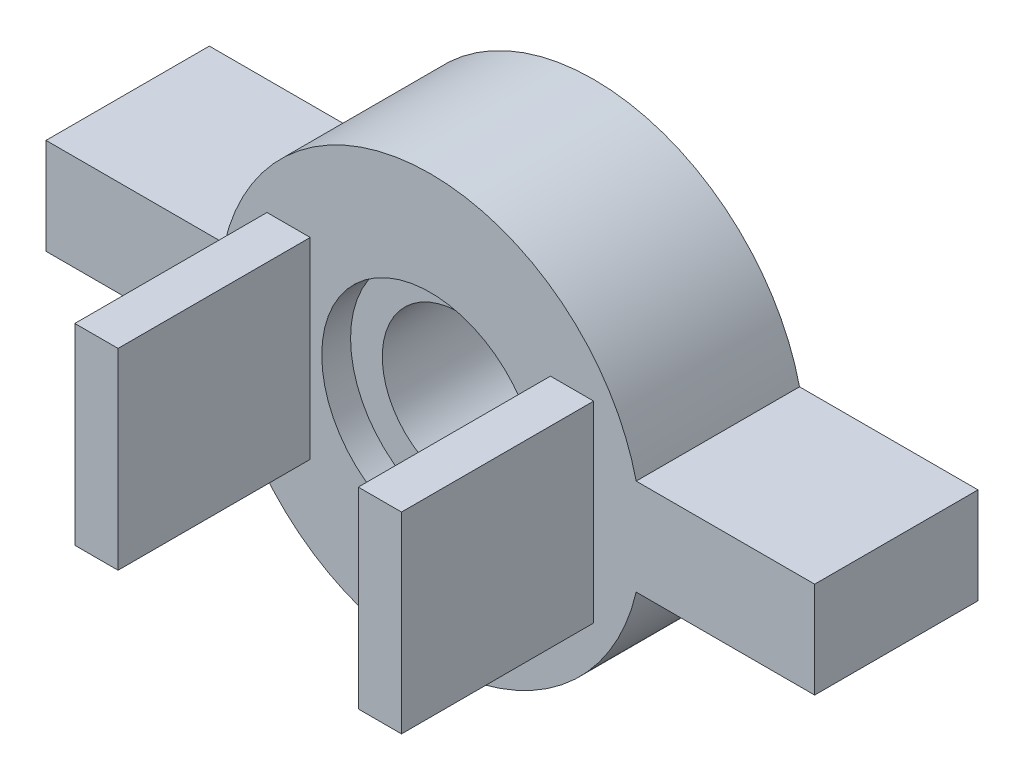
ISO-10303-21;
HEADER;
FILE_DESCRIPTION(('STEP AP214'),'2;1');
FILE_NAME('part.step','',(''),(''),'','','');
FILE_SCHEMA(('AUTOMOTIVE_DESIGN { 1 0 10303 214 1 1 1 1 }'));
ENDSEC;
DATA;
#1=APPLICATION_CONTEXT('core data for automotive mechanical design processes');
#2=APPLICATION_PROTOCOL_DEFINITION('international standard','automotive_design',2000,#1);
#3=PRODUCT_CONTEXT('',#1,'mechanical');
#4=PRODUCT('Part','Part','',(#3));
#5=PRODUCT_RELATED_PRODUCT_CATEGORY('part','',(#4));
#6=PRODUCT_DEFINITION_FORMATION('','',#4);
#7=PRODUCT_DEFINITION_CONTEXT('part definition',#1,'design');
#8=PRODUCT_DEFINITION('design','',#6,#7);
#9=PRODUCT_DEFINITION_SHAPE('','',#8);
#10=(LENGTH_UNIT() NAMED_UNIT(*) SI_UNIT(.MILLI.,.METRE.));
#11=(NAMED_UNIT(*) PLANE_ANGLE_UNIT() SI_UNIT($,.RADIAN.));
#12=(NAMED_UNIT(*) SI_UNIT($,.STERADIAN.) SOLID_ANGLE_UNIT());
#13=UNCERTAINTY_MEASURE_WITH_UNIT(LENGTH_MEASURE(1.E-05),#10,'distance_accuracy_value','');
#14=(GEOMETRIC_REPRESENTATION_CONTEXT(3) GLOBAL_UNCERTAINTY_ASSIGNED_CONTEXT((#13)) GLOBAL_UNIT_ASSIGNED_CONTEXT((#10,
#11,#12)) REPRESENTATION_CONTEXT('',''));
#15=CARTESIAN_POINT('',(0.,0.,0.));
#16=DIRECTION('',(0.,0.,1.));
#17=DIRECTION('',(1.,0.,0.));
#18=AXIS2_PLACEMENT_3D('',#15,#16,#17);
#19=CARTESIAN_POINT('',(0.,0.,-0.000999999999999265));
#20=DIRECTION('',(0.,0.,1.));
#21=DIRECTION('',(1.,0.,0.));
#22=AXIS2_PLACEMENT_3D('',#19,#20,#21);
#23=CYLINDRICAL_SURFACE('',#22,4.);
#24=CARTESIAN_POINT('',(0.,0.,0.));
#25=DIRECTION('',(0.,0.,1.));
#26=DIRECTION('',(1.,0.,0.));
#27=AXIS2_PLACEMENT_3D('',#24,#25,#26);
#28=CIRCLE('',#27,4.);
#29=CARTESIAN_POINT('',(4.,0.,0.));
#30=VERTEX_POINT('',#29);
#31=EDGE_CURVE('E203',#30,#30,#28,.F.);
#32=ORIENTED_EDGE('',*,*,#31,.T.);
#33=EDGE_LOOP('',(#32));
#34=FACE_BOUND('',#33,.T.);
#35=CARTESIAN_POINT('',(0.,0.,7.));
#36=DIRECTION('',(0.,0.,1.));
#37=DIRECTION('',(1.,0.,0.));
#38=AXIS2_PLACEMENT_3D('',#35,#36,#37);
#39=CIRCLE('',#38,4.);
#40=CARTESIAN_POINT('',(4.,0.,7.));
#41=VERTEX_POINT('',#40);
#42=EDGE_CURVE('E36',#41,#41,#39,.F.);
#43=ORIENTED_EDGE('',*,*,#42,.F.);
#44=EDGE_LOOP('',(#43));
#45=FACE_BOUND('',#44,.T.);
#46=ADVANCED_FACE('F32',(#34,#45),#23,.F.);
#47=CARTESIAN_POINT('',(0.,0.,8.5));
#48=DIRECTION('',(0.,0.,1.));
#49=DIRECTION('',(1.,0.,0.));
#50=AXIS2_PLACEMENT_3D('',#47,#48,#49);
#51=PLANE('',#50);
#52=CARTESIAN_POINT('',(0.,0.,8.5));
#53=DIRECTION('',(0.,0.,1.));
#54=DIRECTION('',(1.,0.,0.));
#55=AXIS2_PLACEMENT_3D('',#52,#53,#54);
#56=CIRCLE('',#55,5.65);
#57=CARTESIAN_POINT('',(5.65,0.,8.5));
#58=VERTEX_POINT('',#57);
#59=EDGE_CURVE('E509',#58,#58,#56,.T.);
#60=ORIENTED_EDGE('',*,*,#59,.F.);
#61=EDGE_LOOP('',(#60));
#62=FACE_BOUND('',#61,.T.);
#63=CARTESIAN_POINT('',(0.,0.,8.5));
#64=DIRECTION('',(0.,0.,1.));
#65=DIRECTION('',(1.,0.,0.));
#66=AXIS2_PLACEMENT_3D('',#63,#64,#65);
#67=CIRCLE('',#66,11.);
#68=CARTESIAN_POINT('',(10.7121426428143,2.5,8.5));
#69=VERTEX_POINT('',#68);
#70=CARTESIAN_POINT('',(-10.7121426428143,2.5,8.5));
#71=VERTEX_POINT('',#70);
#72=EDGE_CURVE('E207',#69,#71,#67,.T.);
#73=ORIENTED_EDGE('',*,*,#72,.T.);
#74=DIRECTION('',(-1.,0.,0.));
#75=VECTOR('',#74,1.);
#76=CARTESIAN_POINT('',(-20.,2.5,8.5));
#77=LINE('',#76,#75);
#78=CARTESIAN_POINT('',(-20.,2.5,8.5));
#79=VERTEX_POINT('',#78);
#80=EDGE_CURVE('E210',#71,#79,#77,.T.);
#81=ORIENTED_EDGE('',*,*,#80,.T.);
#82=DIRECTION('',(0.,-1.,0.));
#83=VECTOR('',#82,1.);
#84=CARTESIAN_POINT('',(-20.,2.5,8.5));
#85=LINE('',#84,#83);
#86=CARTESIAN_POINT('',(-20.,-2.5,8.5));
#87=VERTEX_POINT('',#86);
#88=EDGE_CURVE('E213',#79,#87,#85,.T.);
#89=ORIENTED_EDGE('',*,*,#88,.T.);
#90=DIRECTION('',(1.,0.,0.));
#91=VECTOR('',#90,1.);
#92=CARTESIAN_POINT('',(-20.,-2.5,8.5));
#93=LINE('',#92,#91);
#94=CARTESIAN_POINT('',(-10.7121426428143,-2.5,8.5));
#95=VERTEX_POINT('',#94);
#96=EDGE_CURVE('E215',#87,#95,#93,.T.);
#97=ORIENTED_EDGE('',*,*,#96,.T.);
#98=CARTESIAN_POINT('',(0.,0.,8.5));
#99=DIRECTION('',(0.,0.,1.));
#100=DIRECTION('',(1.,0.,0.));
#101=AXIS2_PLACEMENT_3D('',#98,#99,#100);
#102=CIRCLE('',#101,11.);
#103=CARTESIAN_POINT('',(10.7121426428143,-2.50000000000001,8.5));
#104=VERTEX_POINT('',#103);
#105=EDGE_CURVE('E217',#95,#104,#102,.T.);
#106=ORIENTED_EDGE('',*,*,#105,.T.);
#107=DIRECTION('',(1.,0.,0.));
#108=VECTOR('',#107,1.);
#109=CARTESIAN_POINT('',(10.7121426428143,-2.5,8.5));
#110=LINE('',#109,#108);
#111=CARTESIAN_POINT('',(20.,-2.5,8.5));
#112=VERTEX_POINT('',#111);
#113=EDGE_CURVE('E219',#104,#112,#110,.T.);
#114=ORIENTED_EDGE('',*,*,#113,.T.);
#115=DIRECTION('',(0.,1.,0.));
#116=VECTOR('',#115,1.);
#117=CARTESIAN_POINT('',(20.,2.5,8.5));
#118=LINE('',#117,#116);
#119=CARTESIAN_POINT('',(20.,2.5,8.5));
#120=VERTEX_POINT('',#119);
#121=EDGE_CURVE('E221',#112,#120,#118,.T.);
#122=ORIENTED_EDGE('',*,*,#121,.T.);
#123=DIRECTION('',(-1.,0.,0.));
#124=VECTOR('',#123,1.);
#125=CARTESIAN_POINT('',(10.7121426428143,2.5,8.5));
#126=LINE('',#125,#124);
#127=EDGE_CURVE('E223',#120,#69,#126,.T.);
#128=ORIENTED_EDGE('',*,*,#127,.T.);
#129=EDGE_LOOP('',(#73,#81,#89,#97,#106,#114,#122,#128));
#130=FACE_BOUND('',#129,.T.);
#131=DIRECTION('',(1.,0.,0.));
#132=VECTOR('',#131,1.);
#133=CARTESIAN_POINT('',(6.25,-5.,8.5));
#134=LINE('',#133,#132);
#135=CARTESIAN_POINT('',(6.25,-5.,8.5));
#136=VERTEX_POINT('',#135);
#137=CARTESIAN_POINT('',(8.5,-5.,8.5));
#138=VERTEX_POINT('',#137);
#139=EDGE_CURVE('E175',#136,#138,#134,.T.);
#140=ORIENTED_EDGE('',*,*,#139,.F.);
#141=DIRECTION('',(0.,-1.,0.));
#142=VECTOR('',#141,1.);
#143=CARTESIAN_POINT('',(6.25,-5.,8.5));
#144=LINE('',#143,#142);
#145=CARTESIAN_POINT('',(6.25,5.,8.5));
#146=VERTEX_POINT('',#145);
#147=EDGE_CURVE('E172',#146,#136,#144,.T.);
#148=ORIENTED_EDGE('',*,*,#147,.F.);
#149=DIRECTION('',(-1.,0.,0.));
#150=VECTOR('',#149,1.);
#151=CARTESIAN_POINT('',(6.25,5.,8.5));
#152=LINE('',#151,#150);
#153=CARTESIAN_POINT('',(8.5,5.,8.5));
#154=VERTEX_POINT('',#153);
#155=EDGE_CURVE('E184',#154,#146,#152,.T.);
#156=ORIENTED_EDGE('',*,*,#155,.F.);
#157=DIRECTION('',(0.,1.,0.));
#158=VECTOR('',#157,1.);
#159=CARTESIAN_POINT('',(8.5,5.,8.5));
#160=LINE('',#159,#158);
#161=EDGE_CURVE('E192',#138,#154,#160,.T.);
#162=ORIENTED_EDGE('',*,*,#161,.F.);
#163=EDGE_LOOP('',(#140,#148,#156,#162));
#164=FACE_BOUND('',#163,.T.);
#165=DIRECTION('',(0.,1.,0.));
#166=VECTOR('',#165,1.);
#167=CARTESIAN_POINT('',(-6.25,-5.,8.5));
#168=LINE('',#167,#166);
#169=CARTESIAN_POINT('',(-6.25,-5.,8.5));
#170=VERTEX_POINT('',#169);
#171=CARTESIAN_POINT('',(-6.25,5.,8.5));
#172=VERTEX_POINT('',#171);
#173=EDGE_CURVE('E517',#170,#172,#168,.T.);
#174=ORIENTED_EDGE('',*,*,#173,.F.);
#175=DIRECTION('',(1.,0.,0.));
#176=VECTOR('',#175,1.);
#177=CARTESIAN_POINT('',(-8.5,-5.,8.5));
#178=LINE('',#177,#176);
#179=CARTESIAN_POINT('',(-8.5,-5.,8.5));
#180=VERTEX_POINT('',#179);
#181=EDGE_CURVE('E170',#180,#170,#178,.T.);
#182=ORIENTED_EDGE('',*,*,#181,.F.);
#183=DIRECTION('',(0.,-1.,0.));
#184=VECTOR('',#183,1.);
#185=CARTESIAN_POINT('',(-8.5,5.,8.5));
#186=LINE('',#185,#184);
#187=CARTESIAN_POINT('',(-8.5,5.,8.5));
#188=VERTEX_POINT('',#187);
#189=EDGE_CURVE('E166',#188,#180,#186,.T.);
#190=ORIENTED_EDGE('',*,*,#189,.F.);
#191=DIRECTION('',(-1.,0.,0.));
#192=VECTOR('',#191,1.);
#193=CARTESIAN_POINT('',(-8.5,5.,8.5));
#194=LINE('',#193,#192);
#195=EDGE_CURVE('E519',#172,#188,#194,.T.);
#196=ORIENTED_EDGE('',*,*,#195,.F.);
#197=EDGE_LOOP('',(#174,#182,#190,#196));
#198=FACE_BOUND('',#197,.T.);
#199=ADVANCED_FACE('F282',(#62,#130,#164,#198),#51,.T.);
#200=CARTESIAN_POINT('',(0.,0.,8.5));
#201=DIRECTION('',(0.,0.,-1.));
#202=DIRECTION('',(-1.,0.,0.));
#203=AXIS2_PLACEMENT_3D('',#200,#201,#202);
#204=CYLINDRICAL_SURFACE('',#203,11.);
#205=CARTESIAN_POINT('',(0.,0.,0.));
#206=DIRECTION('',(0.,0.,1.));
#207=DIRECTION('',(1.,0.,0.));
#208=AXIS2_PLACEMENT_3D('',#205,#206,#207);
#209=CIRCLE('',#208,11.);
#210=CARTESIAN_POINT('',(10.7121426428143,2.5,0.));
#211=VERTEX_POINT('',#210);
#212=CARTESIAN_POINT('',(-10.7121426428143,2.5,0.));
#213=VERTEX_POINT('',#212);
#214=EDGE_CURVE('E206',#211,#213,#209,.T.);
#215=ORIENTED_EDGE('',*,*,#214,.T.);
#216=DIRECTION('',(0.,0.,-1.));
#217=VECTOR('',#216,1.);
#218=CARTESIAN_POINT('',(-10.7121426428143,2.5,8.5));
#219=LINE('',#218,#217);
#220=EDGE_CURVE('E11',#71,#213,#219,.T.);
#221=ORIENTED_EDGE('',*,*,#220,.F.);
#222=ORIENTED_EDGE('',*,*,#72,.F.);
#223=DIRECTION('',(0.,0.,-1.));
#224=VECTOR('',#223,1.);
#225=CARTESIAN_POINT('',(10.7121426428143,2.5,8.5));
#226=LINE('',#225,#224);
#227=EDGE_CURVE('E225',#69,#211,#226,.T.);
#228=ORIENTED_EDGE('',*,*,#227,.T.);
#229=EDGE_LOOP('',(#215,#221,#222,#228));
#230=FACE_BOUND('',#229,.T.);
#231=ADVANCED_FACE('F34',(#230),#204,.T.);
#232=CARTESIAN_POINT('',(-20.,2.5,8.5));
#233=DIRECTION('',(0.,-1.,0.));
#234=DIRECTION('',(0.,0.,-1.));
#235=AXIS2_PLACEMENT_3D('',#232,#233,#234);
#236=PLANE('',#235);
#237=DIRECTION('',(-1.,0.,0.));
#238=VECTOR('',#237,1.);
#239=CARTESIAN_POINT('',(-20.,2.5,0.));
#240=LINE('',#239,#238);
#241=CARTESIAN_POINT('',(-20.,2.5,0.));
#242=VERTEX_POINT('',#241);
#243=EDGE_CURVE('E228',#213,#242,#240,.T.);
#244=ORIENTED_EDGE('',*,*,#243,.T.);
#245=DIRECTION('',(0.,0.,-1.));
#246=VECTOR('',#245,1.);
#247=CARTESIAN_POINT('',(-20.,2.5,8.5));
#248=LINE('',#247,#246);
#249=EDGE_CURVE('E41',#79,#242,#248,.T.);
#250=ORIENTED_EDGE('',*,*,#249,.F.);
#251=ORIENTED_EDGE('',*,*,#80,.F.);
#252=ORIENTED_EDGE('',*,*,#220,.T.);
#253=EDGE_LOOP('',(#244,#250,#251,#252));
#254=FACE_BOUND('',#253,.T.);
#255=ADVANCED_FACE('F287',(#254),#236,.F.);
#256=CARTESIAN_POINT('',(-20.,2.5,8.5));
#257=DIRECTION('',(1.,0.,0.));
#258=DIRECTION('',(0.,0.,-1.));
#259=AXIS2_PLACEMENT_3D('',#256,#257,#258);
#260=PLANE('',#259);
#261=DIRECTION('',(0.,-1.,0.));
#262=VECTOR('',#261,1.);
#263=CARTESIAN_POINT('',(-20.,2.5,0.));
#264=LINE('',#263,#262);
#265=CARTESIAN_POINT('',(-20.,-2.5,0.));
#266=VERTEX_POINT('',#265);
#267=EDGE_CURVE('E230',#242,#266,#264,.T.);
#268=ORIENTED_EDGE('',*,*,#267,.T.);
#269=DIRECTION('',(0.,0.,-1.));
#270=VECTOR('',#269,1.);
#271=CARTESIAN_POINT('',(-20.,-2.5,8.5));
#272=LINE('',#271,#270);
#273=EDGE_CURVE('E255',#87,#266,#272,.T.);
#274=ORIENTED_EDGE('',*,*,#273,.F.);
#275=ORIENTED_EDGE('',*,*,#88,.F.);
#276=ORIENTED_EDGE('',*,*,#249,.T.);
#277=EDGE_LOOP('',(#268,#274,#275,#276));
#278=FACE_BOUND('',#277,.T.);
#279=ADVANCED_FACE('F263',(#278),#260,.F.);
#280=CARTESIAN_POINT('',(-20.,-2.5,8.5));
#281=DIRECTION('',(0.,1.,0.));
#282=DIRECTION('',(0.,0.,1.));
#283=AXIS2_PLACEMENT_3D('',#280,#281,#282);
#284=PLANE('',#283);
#285=DIRECTION('',(1.,0.,0.));
#286=VECTOR('',#285,1.);
#287=CARTESIAN_POINT('',(-20.,-2.5,0.));
#288=LINE('',#287,#286);
#289=CARTESIAN_POINT('',(-10.7121426428143,-2.5,0.));
#290=VERTEX_POINT('',#289);
#291=EDGE_CURVE('E232',#266,#290,#288,.T.);
#292=ORIENTED_EDGE('',*,*,#291,.T.);
#293=DIRECTION('',(0.,0.,-1.));
#294=VECTOR('',#293,1.);
#295=CARTESIAN_POINT('',(-10.7121426428143,-2.5,8.5));
#296=LINE('',#295,#294);
#297=EDGE_CURVE('E252',#95,#290,#296,.T.);
#298=ORIENTED_EDGE('',*,*,#297,.F.);
#299=ORIENTED_EDGE('',*,*,#96,.F.);
#300=ORIENTED_EDGE('',*,*,#273,.T.);
#301=EDGE_LOOP('',(#292,#298,#299,#300));
#302=FACE_BOUND('',#301,.T.);
#303=ADVANCED_FACE('F274',(#302),#284,.F.);
#304=CARTESIAN_POINT('',(0.,0.,8.5));
#305=DIRECTION('',(0.,0.,-1.));
#306=DIRECTION('',(-1.,0.,0.));
#307=AXIS2_PLACEMENT_3D('',#304,#305,#306);
#308=CYLINDRICAL_SURFACE('',#307,11.);
#309=CARTESIAN_POINT('',(0.,0.,0.));
#310=DIRECTION('',(0.,0.,1.));
#311=DIRECTION('',(1.,0.,0.));
#312=AXIS2_PLACEMENT_3D('',#309,#310,#311);
#313=CIRCLE('',#312,11.);
#314=CARTESIAN_POINT('',(10.7121426428143,-2.50000000000001,0.));
#315=VERTEX_POINT('',#314);
#316=EDGE_CURVE('E234',#290,#315,#313,.T.);
#317=ORIENTED_EDGE('',*,*,#316,.T.);
#318=DIRECTION('',(0.,0.,-1.));
#319=VECTOR('',#318,1.);
#320=CARTESIAN_POINT('',(10.7121426428143,-2.50000000000001,8.5));
#321=LINE('',#320,#319);
#322=EDGE_CURVE('E249',#104,#315,#321,.T.);
#323=ORIENTED_EDGE('',*,*,#322,.F.);
#324=ORIENTED_EDGE('',*,*,#105,.F.);
#325=ORIENTED_EDGE('',*,*,#297,.T.);
#326=EDGE_LOOP('',(#317,#323,#324,#325));
#327=FACE_BOUND('',#326,.T.);
#328=ADVANCED_FACE('F278',(#327),#308,.T.);
#329=CARTESIAN_POINT('',(10.7121426428143,-2.5,8.5));
#330=DIRECTION('',(0.,1.,0.));
#331=DIRECTION('',(0.,0.,1.));
#332=AXIS2_PLACEMENT_3D('',#329,#330,#331);
#333=PLANE('',#332);
#334=DIRECTION('',(1.,0.,0.));
#335=VECTOR('',#334,1.);
#336=CARTESIAN_POINT('',(10.7121426428143,-2.5,0.));
#337=LINE('',#336,#335);
#338=CARTESIAN_POINT('',(20.,-2.5,0.));
#339=VERTEX_POINT('',#338);
#340=EDGE_CURVE('E236',#315,#339,#337,.T.);
#341=ORIENTED_EDGE('',*,*,#340,.T.);
#342=DIRECTION('',(0.,0.,-1.));
#343=VECTOR('',#342,1.);
#344=CARTESIAN_POINT('',(20.,-2.5,8.5));
#345=LINE('',#344,#343);
#346=EDGE_CURVE('E246',#112,#339,#345,.T.);
#347=ORIENTED_EDGE('',*,*,#346,.F.);
#348=ORIENTED_EDGE('',*,*,#113,.F.);
#349=ORIENTED_EDGE('',*,*,#322,.T.);
#350=EDGE_LOOP('',(#341,#347,#348,#349));
#351=FACE_BOUND('',#350,.T.);
#352=ADVANCED_FACE('F300',(#351),#333,.F.);
#353=CARTESIAN_POINT('',(20.,2.5,8.5));
#354=DIRECTION('',(-1.,0.,0.));
#355=DIRECTION('',(0.,0.,1.));
#356=AXIS2_PLACEMENT_3D('',#353,#354,#355);
#357=PLANE('',#356);
#358=DIRECTION('',(0.,1.,0.));
#359=VECTOR('',#358,1.);
#360=CARTESIAN_POINT('',(20.,2.5,0.));
#361=LINE('',#360,#359);
#362=CARTESIAN_POINT('',(20.,2.5,0.));
#363=VERTEX_POINT('',#362);
#364=EDGE_CURVE('E238',#339,#363,#361,.T.);
#365=ORIENTED_EDGE('',*,*,#364,.T.);
#366=DIRECTION('',(0.,0.,-1.));
#367=VECTOR('',#366,1.);
#368=CARTESIAN_POINT('',(20.,2.5,8.5));
#369=LINE('',#368,#367);
#370=EDGE_CURVE('E243',#120,#363,#369,.T.);
#371=ORIENTED_EDGE('',*,*,#370,.F.);
#372=ORIENTED_EDGE('',*,*,#121,.F.);
#373=ORIENTED_EDGE('',*,*,#346,.T.);
#374=EDGE_LOOP('',(#365,#371,#372,#373));
#375=FACE_BOUND('',#374,.T.);
#376=ADVANCED_FACE('F298',(#375),#357,.F.);
#377=CARTESIAN_POINT('',(10.7121426428143,2.5,8.5));
#378=DIRECTION('',(0.,-1.,0.));
#379=DIRECTION('',(0.,0.,-1.));
#380=AXIS2_PLACEMENT_3D('',#377,#378,#379);
#381=PLANE('',#380);
#382=DIRECTION('',(-1.,0.,0.));
#383=VECTOR('',#382,1.);
#384=CARTESIAN_POINT('',(10.7121426428143,2.5,0.));
#385=LINE('',#384,#383);
#386=EDGE_CURVE('E211',#363,#211,#385,.T.);
#387=ORIENTED_EDGE('',*,*,#386,.T.);
#388=ORIENTED_EDGE('',*,*,#227,.F.);
#389=ORIENTED_EDGE('',*,*,#127,.F.);
#390=ORIENTED_EDGE('',*,*,#370,.T.);
#391=EDGE_LOOP('',(#387,#388,#389,#390));
#392=FACE_BOUND('',#391,.T.);
#393=ADVANCED_FACE('F293',(#392),#381,.F.);
#394=CARTESIAN_POINT('',(0.,0.,0.));
#395=DIRECTION('',(0.,0.,1.));
#396=DIRECTION('',(1.,0.,0.));
#397=AXIS2_PLACEMENT_3D('',#394,#395,#396);
#398=PLANE('',#397);
#399=ORIENTED_EDGE('',*,*,#31,.F.);
#400=EDGE_LOOP('',(#399));
#401=FACE_BOUND('',#400,.T.);
#402=ORIENTED_EDGE('',*,*,#214,.F.);
#403=ORIENTED_EDGE('',*,*,#386,.F.);
#404=ORIENTED_EDGE('',*,*,#364,.F.);
#405=ORIENTED_EDGE('',*,*,#340,.F.);
#406=ORIENTED_EDGE('',*,*,#316,.F.);
#407=ORIENTED_EDGE('',*,*,#291,.F.);
#408=ORIENTED_EDGE('',*,*,#267,.F.);
#409=ORIENTED_EDGE('',*,*,#243,.F.);
#410=EDGE_LOOP('',(#402,#403,#404,#405,#406,#407,#408,#409));
#411=FACE_BOUND('',#410,.T.);
#412=ADVANCED_FACE('F269',(#401,#411),#398,.F.);
#413=CARTESIAN_POINT('',(6.25,-5.,18.5));
#414=DIRECTION('',(1.,0.,0.));
#415=DIRECTION('',(0.,0.,-1.));
#416=AXIS2_PLACEMENT_3D('',#413,#414,#415);
#417=PLANE('',#416);
#418=ORIENTED_EDGE('',*,*,#147,.T.);
#419=DIRECTION('',(0.,0.,-1.));
#420=VECTOR('',#419,1.);
#421=CARTESIAN_POINT('',(6.25,-5.,18.5));
#422=LINE('',#421,#420);
#423=CARTESIAN_POINT('',(6.25,-5.,18.5));
#424=VERTEX_POINT('',#423);
#425=EDGE_CURVE('E201',#424,#136,#422,.T.);
#426=ORIENTED_EDGE('',*,*,#425,.F.);
#427=DIRECTION('',(0.,-1.,0.));
#428=VECTOR('',#427,1.);
#429=CARTESIAN_POINT('',(6.25,-5.,18.5));
#430=LINE('',#429,#428);
#431=CARTESIAN_POINT('',(6.25,5.,18.5));
#432=VERTEX_POINT('',#431);
#433=EDGE_CURVE('E180',#432,#424,#430,.T.);
#434=ORIENTED_EDGE('',*,*,#433,.F.);
#435=DIRECTION('',(0.,0.,-1.));
#436=VECTOR('',#435,1.);
#437=CARTESIAN_POINT('',(6.25,5.,18.5));
#438=LINE('',#437,#436);
#439=EDGE_CURVE('E189',#432,#146,#438,.T.);
#440=ORIENTED_EDGE('',*,*,#439,.T.);
#441=EDGE_LOOP('',(#418,#426,#434,#440));
#442=FACE_BOUND('',#441,.T.);
#443=ADVANCED_FACE('F319',(#442),#417,.F.);
#444=CARTESIAN_POINT('',(6.25,-5.,18.5));
#445=DIRECTION('',(0.,1.,0.));
#446=DIRECTION('',(0.,0.,1.));
#447=AXIS2_PLACEMENT_3D('',#444,#445,#446);
#448=PLANE('',#447);
#449=ORIENTED_EDGE('',*,*,#139,.T.);
#450=DIRECTION('',(0.,0.,-1.));
#451=VECTOR('',#450,1.);
#452=CARTESIAN_POINT('',(8.5,-5.,18.5));
#453=LINE('',#452,#451);
#454=CARTESIAN_POINT('',(8.5,-5.,18.5));
#455=VERTEX_POINT('',#454);
#456=EDGE_CURVE('E198',#455,#138,#453,.T.);
#457=ORIENTED_EDGE('',*,*,#456,.F.);
#458=DIRECTION('',(1.,0.,0.));
#459=VECTOR('',#458,1.);
#460=CARTESIAN_POINT('',(6.25,-5.,18.5));
#461=LINE('',#460,#459);
#462=EDGE_CURVE('E183',#424,#455,#461,.T.);
#463=ORIENTED_EDGE('',*,*,#462,.F.);
#464=ORIENTED_EDGE('',*,*,#425,.T.);
#465=EDGE_LOOP('',(#449,#457,#463,#464));
#466=FACE_BOUND('',#465,.T.);
#467=ADVANCED_FACE('F340',(#466),#448,.F.);
#468=CARTESIAN_POINT('',(8.5,5.,18.5));
#469=DIRECTION('',(-1.,0.,0.));
#470=DIRECTION('',(0.,0.,1.));
#471=AXIS2_PLACEMENT_3D('',#468,#469,#470);
#472=PLANE('',#471);
#473=ORIENTED_EDGE('',*,*,#161,.T.);
#474=DIRECTION('',(0.,0.,-1.));
#475=VECTOR('',#474,1.);
#476=CARTESIAN_POINT('',(8.5,5.,18.5));
#477=LINE('',#476,#475);
#478=CARTESIAN_POINT('',(8.5,5.,18.5));
#479=VERTEX_POINT('',#478);
#480=EDGE_CURVE('E56',#479,#154,#477,.T.);
#481=ORIENTED_EDGE('',*,*,#480,.F.);
#482=DIRECTION('',(0.,1.,0.));
#483=VECTOR('',#482,1.);
#484=CARTESIAN_POINT('',(8.5,5.,18.5));
#485=LINE('',#484,#483);
#486=EDGE_CURVE('E186',#455,#479,#485,.T.);
#487=ORIENTED_EDGE('',*,*,#486,.F.);
#488=ORIENTED_EDGE('',*,*,#456,.T.);
#489=EDGE_LOOP('',(#473,#481,#487,#488));
#490=FACE_BOUND('',#489,.T.);
#491=ADVANCED_FACE('F347',(#490),#472,.F.);
#492=CARTESIAN_POINT('',(6.25,5.,18.5));
#493=DIRECTION('',(0.,-1.,0.));
#494=DIRECTION('',(0.,0.,-1.));
#495=AXIS2_PLACEMENT_3D('',#492,#493,#494);
#496=PLANE('',#495);
#497=ORIENTED_EDGE('',*,*,#155,.T.);
#498=ORIENTED_EDGE('',*,*,#439,.F.);
#499=DIRECTION('',(-1.,0.,0.));
#500=VECTOR('',#499,1.);
#501=CARTESIAN_POINT('',(6.25,5.,18.5));
#502=LINE('',#501,#500);
#503=EDGE_CURVE('E188',#479,#432,#502,.T.);
#504=ORIENTED_EDGE('',*,*,#503,.F.);
#505=ORIENTED_EDGE('',*,*,#480,.T.);
#506=EDGE_LOOP('',(#497,#498,#504,#505));
#507=FACE_BOUND('',#506,.T.);
#508=ADVANCED_FACE('F354',(#507),#496,.F.);
#509=CARTESIAN_POINT('',(0.,0.,18.5));
#510=DIRECTION('',(0.,0.,-1.));
#511=DIRECTION('',(-1.,0.,0.));
#512=AXIS2_PLACEMENT_3D('',#509,#510,#511);
#513=PLANE('',#512);
#514=ORIENTED_EDGE('',*,*,#433,.T.);
#515=ORIENTED_EDGE('',*,*,#462,.T.);
#516=ORIENTED_EDGE('',*,*,#486,.T.);
#517=ORIENTED_EDGE('',*,*,#503,.T.);
#518=EDGE_LOOP('',(#514,#515,#516,#517));
#519=FACE_BOUND('',#518,.T.);
#520=ADVANCED_FACE('F362',(#519),#513,.F.);
#521=CARTESIAN_POINT('',(-8.5,-5.,18.5));
#522=DIRECTION('',(0.,1.,0.));
#523=DIRECTION('',(0.,0.,1.));
#524=AXIS2_PLACEMENT_3D('',#521,#522,#523);
#525=PLANE('',#524);
#526=ORIENTED_EDGE('',*,*,#181,.T.);
#527=DIRECTION('',(0.,0.,-1.));
#528=VECTOR('',#527,1.);
#529=CARTESIAN_POINT('',(-6.25,-5.,18.5));
#530=LINE('',#529,#528);
#531=CARTESIAN_POINT('',(-6.25,-5.,18.5));
#532=VERTEX_POINT('',#531);
#533=EDGE_CURVE('E151',#532,#170,#530,.T.);
#534=ORIENTED_EDGE('',*,*,#533,.F.);
#535=DIRECTION('',(1.,0.,0.));
#536=VECTOR('',#535,1.);
#537=CARTESIAN_POINT('',(-8.5,-5.,18.5));
#538=LINE('',#537,#536);
#539=CARTESIAN_POINT('',(-8.5,-5.,18.5));
#540=VERTEX_POINT('',#539);
#541=EDGE_CURVE('E158',#540,#532,#538,.T.);
#542=ORIENTED_EDGE('',*,*,#541,.F.);
#543=DIRECTION('',(0.,0.,-1.));
#544=VECTOR('',#543,1.);
#545=CARTESIAN_POINT('',(-8.5,-5.,18.5));
#546=LINE('',#545,#544);
#547=EDGE_CURVE('E515',#540,#180,#546,.T.);
#548=ORIENTED_EDGE('',*,*,#547,.T.);
#549=EDGE_LOOP('',(#526,#534,#542,#548));
#550=FACE_BOUND('',#549,.T.);
#551=ADVANCED_FACE('F168',(#550),#525,.F.);
#552=CARTESIAN_POINT('',(-6.25,-5.,18.5));
#553=DIRECTION('',(-1.,0.,0.));
#554=DIRECTION('',(0.,0.,1.));
#555=AXIS2_PLACEMENT_3D('',#552,#553,#554);
#556=PLANE('',#555);
#557=ORIENTED_EDGE('',*,*,#173,.T.);
#558=DIRECTION('',(0.,0.,-1.));
#559=VECTOR('',#558,1.);
#560=CARTESIAN_POINT('',(-6.25,5.,18.5));
#561=LINE('',#560,#559);
#562=CARTESIAN_POINT('',(-6.25,5.,18.5));
#563=VERTEX_POINT('',#562);
#564=EDGE_CURVE('E154',#563,#172,#561,.T.);
#565=ORIENTED_EDGE('',*,*,#564,.F.);
#566=DIRECTION('',(0.,1.,0.));
#567=VECTOR('',#566,1.);
#568=CARTESIAN_POINT('',(-6.25,-5.,18.5));
#569=LINE('',#568,#567);
#570=EDGE_CURVE('E147',#532,#563,#569,.T.);
#571=ORIENTED_EDGE('',*,*,#570,.F.);
#572=ORIENTED_EDGE('',*,*,#533,.T.);
#573=EDGE_LOOP('',(#557,#565,#571,#572));
#574=FACE_BOUND('',#573,.T.);
#575=ADVANCED_FACE('F149',(#574),#556,.F.);
#576=CARTESIAN_POINT('',(-8.5,5.,18.5));
#577=DIRECTION('',(0.,-1.,0.));
#578=DIRECTION('',(0.,0.,-1.));
#579=AXIS2_PLACEMENT_3D('',#576,#577,#578);
#580=PLANE('',#579);
#581=ORIENTED_EDGE('',*,*,#195,.T.);
#582=DIRECTION('',(0.,0.,-1.));
#583=VECTOR('',#582,1.);
#584=CARTESIAN_POINT('',(-8.5,5.,18.5));
#585=LINE('',#584,#583);
#586=CARTESIAN_POINT('',(-8.5,5.,18.5));
#587=VERTEX_POINT('',#586);
#588=EDGE_CURVE('E48',#587,#188,#585,.T.);
#589=ORIENTED_EDGE('',*,*,#588,.F.);
#590=DIRECTION('',(-1.,0.,0.));
#591=VECTOR('',#590,1.);
#592=CARTESIAN_POINT('',(-8.5,5.,18.5));
#593=LINE('',#592,#591);
#594=EDGE_CURVE('E157',#563,#587,#593,.T.);
#595=ORIENTED_EDGE('',*,*,#594,.F.);
#596=ORIENTED_EDGE('',*,*,#564,.T.);
#597=EDGE_LOOP('',(#581,#589,#595,#596));
#598=FACE_BOUND('',#597,.T.);
#599=ADVANCED_FACE('F382',(#598),#580,.F.);
#600=CARTESIAN_POINT('',(-8.5,5.,18.5));
#601=DIRECTION('',(1.,0.,0.));
#602=DIRECTION('',(0.,0.,-1.));
#603=AXIS2_PLACEMENT_3D('',#600,#601,#602);
#604=PLANE('',#603);
#605=ORIENTED_EDGE('',*,*,#189,.T.);
#606=ORIENTED_EDGE('',*,*,#547,.F.);
#607=DIRECTION('',(0.,-1.,0.));
#608=VECTOR('',#607,1.);
#609=CARTESIAN_POINT('',(-8.5,5.,18.5));
#610=LINE('',#609,#608);
#611=EDGE_CURVE('E162',#587,#540,#610,.T.);
#612=ORIENTED_EDGE('',*,*,#611,.F.);
#613=ORIENTED_EDGE('',*,*,#588,.T.);
#614=EDGE_LOOP('',(#605,#606,#612,#613));
#615=FACE_BOUND('',#614,.T.);
#616=ADVANCED_FACE('F389',(#615),#604,.F.);
#617=CARTESIAN_POINT('',(0.,0.,18.5));
#618=DIRECTION('',(0.,0.,1.));
#619=DIRECTION('',(1.,0.,0.));
#620=AXIS2_PLACEMENT_3D('',#617,#618,#619);
#621=PLANE('',#620);
#622=ORIENTED_EDGE('',*,*,#541,.T.);
#623=ORIENTED_EDGE('',*,*,#570,.T.);
#624=ORIENTED_EDGE('',*,*,#594,.T.);
#625=ORIENTED_EDGE('',*,*,#611,.T.);
#626=EDGE_LOOP('',(#622,#623,#624,#625));
#627=FACE_BOUND('',#626,.T.);
#628=ADVANCED_FACE('F161',(#627),#621,.T.);
#629=CARTESIAN_POINT('',(0.,0.,7.));
#630=DIRECTION('',(0.,0.,1.));
#631=DIRECTION('',(1.,0.,0.));
#632=AXIS2_PLACEMENT_3D('',#629,#630,#631);
#633=PLANE('',#632);
#634=CARTESIAN_POINT('',(0.,0.,7.));
#635=DIRECTION('',(0.,0.,1.));
#636=DIRECTION('',(1.,0.,0.));
#637=AXIS2_PLACEMENT_3D('',#634,#635,#636);
#638=CIRCLE('',#637,5.65);
#639=CARTESIAN_POINT('',(5.65,0.,7.));
#640=VERTEX_POINT('',#639);
#641=EDGE_CURVE('E506',#640,#640,#638,.T.);
#642=ORIENTED_EDGE('',*,*,#641,.T.);
#643=EDGE_LOOP('',(#642));
#644=FACE_BOUND('',#643,.T.);
#645=ORIENTED_EDGE('',*,*,#42,.T.);
#646=EDGE_LOOP('',(#645));
#647=FACE_BOUND('',#646,.T.);
#648=ADVANCED_FACE('F403',(#644,#647),#633,.T.);
#649=CARTESIAN_POINT('',(0.,0.,7.));
#650=DIRECTION('',(0.,0.,1.));
#651=DIRECTION('',(1.,0.,0.));
#652=AXIS2_PLACEMENT_3D('',#649,#650,#651);
#653=CYLINDRICAL_SURFACE('',#652,5.65);
#654=ORIENTED_EDGE('',*,*,#641,.F.);
#655=EDGE_LOOP('',(#654));
#656=FACE_BOUND('',#655,.T.);
#657=ORIENTED_EDGE('',*,*,#59,.T.);
#658=EDGE_LOOP('',(#657));
#659=FACE_BOUND('',#658,.T.);
#660=ADVANCED_FACE('F410',(#656,#659),#653,.F.);
#661=CLOSED_SHELL('',(#46,#199,#231,#255,#279,#303,#328,#352,#376,#393,#412,#443,#467,#491,#508,
#520,#551,#575,#599,#616,#628,#648,#660));
#662=MANIFOLD_SOLID_BREP('B2',#661);
#663=ADVANCED_BREP_SHAPE_REPRESENTATION('',(#18,#662),#14);
#664=SHAPE_DEFINITION_REPRESENTATION(#9,#663);
ENDSEC;
END-ISO-10303-21;
